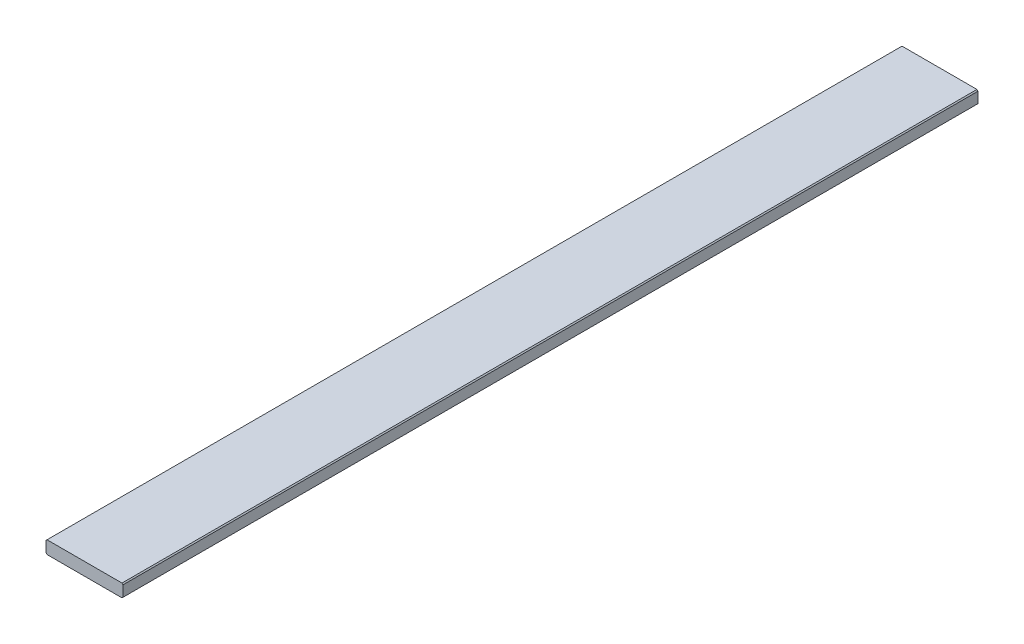
ISO-10303-21;
HEADER;
FILE_DESCRIPTION(('STEP AP214'),'2;1');
FILE_NAME('part.step','',(''),(''),'','','');
FILE_SCHEMA(('AUTOMOTIVE_DESIGN { 1 0 10303 214 1 1 1 1 }'));
ENDSEC;
DATA;
#1=APPLICATION_CONTEXT('core data for automotive mechanical design processes');
#2=APPLICATION_PROTOCOL_DEFINITION('international standard','automotive_design',2000,#1);
#3=PRODUCT_CONTEXT('',#1,'mechanical');
#4=PRODUCT('Part','Part','',(#3));
#5=PRODUCT_RELATED_PRODUCT_CATEGORY('part','',(#4));
#6=PRODUCT_DEFINITION_FORMATION('','',#4);
#7=PRODUCT_DEFINITION_CONTEXT('part definition',#1,'design');
#8=PRODUCT_DEFINITION('design','',#6,#7);
#9=PRODUCT_DEFINITION_SHAPE('','',#8);
#10=(LENGTH_UNIT() NAMED_UNIT(*) SI_UNIT(.MILLI.,.METRE.));
#11=(NAMED_UNIT(*) PLANE_ANGLE_UNIT() SI_UNIT($,.RADIAN.));
#12=(NAMED_UNIT(*) SI_UNIT($,.STERADIAN.) SOLID_ANGLE_UNIT());
#13=UNCERTAINTY_MEASURE_WITH_UNIT(LENGTH_MEASURE(1.E-05),#10,'distance_accuracy_value','');
#14=(GEOMETRIC_REPRESENTATION_CONTEXT(3) GLOBAL_UNCERTAINTY_ASSIGNED_CONTEXT((#13)) GLOBAL_UNIT_ASSIGNED_CONTEXT((#10,
#11,#12)) REPRESENTATION_CONTEXT('',''));
#15=CARTESIAN_POINT('',(0.,0.,0.));
#16=DIRECTION('',(0.,0.,1.));
#17=DIRECTION('',(1.,0.,0.));
#18=AXIS2_PLACEMENT_3D('',#15,#16,#17);
#19=CARTESIAN_POINT('',(-73.,12.5,1665.));
#20=DIRECTION('',(0.,-1.,0.));
#21=DIRECTION('',(0.,0.,-1.));
#22=AXIS2_PLACEMENT_3D('',#19,#20,#21);
#23=PLANE('',#22);
#24=DIRECTION('',(-1.,0.,0.));
#25=VECTOR('',#24,1.);
#26=CARTESIAN_POINT('',(-73.,12.5,0.));
#27=LINE('',#26,#25);
#28=CARTESIAN_POINT('',(73.,12.5,0.));
#29=VERTEX_POINT('',#28);
#30=CARTESIAN_POINT('',(-73.,12.5,0.));
#31=VERTEX_POINT('',#30);
#32=EDGE_CURVE('E130',#29,#31,#27,.T.);
#33=ORIENTED_EDGE('',*,*,#32,.T.);
#34=DIRECTION('',(0.,0.,-1.));
#35=VECTOR('',#34,1.);
#36=CARTESIAN_POINT('',(-73.,12.5,1665.));
#37=LINE('',#36,#35);
#38=CARTESIAN_POINT('',(-73.,12.5,1665.));
#39=VERTEX_POINT('',#38);
#40=EDGE_CURVE('E11',#39,#31,#37,.T.);
#41=ORIENTED_EDGE('',*,*,#40,.F.);
#42=DIRECTION('',(-1.,0.,0.));
#43=VECTOR('',#42,1.);
#44=CARTESIAN_POINT('',(-73.,12.5,1665.));
#45=LINE('',#44,#43);
#46=CARTESIAN_POINT('',(73.,12.5,1665.));
#47=VERTEX_POINT('',#46);
#48=EDGE_CURVE('E144',#47,#39,#45,.T.);
#49=ORIENTED_EDGE('',*,*,#48,.F.);
#50=DIRECTION('',(0.,0.,-1.));
#51=VECTOR('',#50,1.);
#52=CARTESIAN_POINT('',(73.,12.5,1665.));
#53=LINE('',#52,#51);
#54=EDGE_CURVE('E126',#47,#29,#53,.T.);
#55=ORIENTED_EDGE('',*,*,#54,.T.);
#56=EDGE_LOOP('',(#33,#41,#49,#55));
#57=FACE_BOUND('',#56,.T.);
#58=ADVANCED_FACE('F34',(#57),#23,.F.);
#59=CARTESIAN_POINT('',(-75.,10.5,1665.));
#60=DIRECTION('',(0.707106781186547,-0.707106781186548,0.));
#61=DIRECTION('',(0.707106781186548,0.707106781186547,0.));
#62=AXIS2_PLACEMENT_3D('',#59,#60,#61);
#63=PLANE('',#62);
#64=DIRECTION('',(-0.707106781186548,-0.707106781186547,0.));
#65=VECTOR('',#64,1.);
#66=CARTESIAN_POINT('',(-75.,10.5,0.));
#67=LINE('',#66,#65);
#68=CARTESIAN_POINT('',(-75.,10.5,0.));
#69=VERTEX_POINT('',#68);
#70=EDGE_CURVE('E133',#31,#69,#67,.T.);
#71=ORIENTED_EDGE('',*,*,#70,.T.);
#72=DIRECTION('',(0.,0.,-1.));
#73=VECTOR('',#72,1.);
#74=CARTESIAN_POINT('',(-75.,10.5,1665.));
#75=LINE('',#74,#73);
#76=CARTESIAN_POINT('',(-75.,10.5,1665.));
#77=VERTEX_POINT('',#76);
#78=EDGE_CURVE('E42',#77,#69,#75,.T.);
#79=ORIENTED_EDGE('',*,*,#78,.F.);
#80=DIRECTION('',(-0.707106781186548,-0.707106781186547,0.));
#81=VECTOR('',#80,1.);
#82=CARTESIAN_POINT('',(-75.,10.5,1665.));
#83=LINE('',#82,#81);
#84=EDGE_CURVE('E93',#39,#77,#83,.T.);
#85=ORIENTED_EDGE('',*,*,#84,.F.);
#86=ORIENTED_EDGE('',*,*,#40,.T.);
#87=EDGE_LOOP('',(#71,#79,#85,#86));
#88=FACE_BOUND('',#87,.T.);
#89=ADVANCED_FACE('F179',(#88),#63,.F.);
#90=CARTESIAN_POINT('',(-75.,10.5,1665.));
#91=DIRECTION('',(1.,0.,0.));
#92=DIRECTION('',(0.,0.,-1.));
#93=AXIS2_PLACEMENT_3D('',#90,#91,#92);
#94=PLANE('',#93);
#95=DIRECTION('',(0.,-1.,0.));
#96=VECTOR('',#95,1.);
#97=CARTESIAN_POINT('',(-75.,10.5,0.));
#98=LINE('',#97,#96);
#99=CARTESIAN_POINT('',(-75.,-10.5,0.));
#100=VERTEX_POINT('',#99);
#101=EDGE_CURVE('E135',#69,#100,#98,.T.);
#102=ORIENTED_EDGE('',*,*,#101,.T.);
#103=DIRECTION('',(0.,0.,-1.));
#104=VECTOR('',#103,1.);
#105=CARTESIAN_POINT('',(-75.,-10.5,1665.));
#106=LINE('',#105,#104);
#107=CARTESIAN_POINT('',(-75.,-10.5,1665.));
#108=VERTEX_POINT('',#107);
#109=EDGE_CURVE('E151',#108,#100,#106,.T.);
#110=ORIENTED_EDGE('',*,*,#109,.F.);
#111=DIRECTION('',(0.,-1.,0.));
#112=VECTOR('',#111,1.);
#113=CARTESIAN_POINT('',(-75.,10.5,1665.));
#114=LINE('',#113,#112);
#115=EDGE_CURVE('E159',#77,#108,#114,.T.);
#116=ORIENTED_EDGE('',*,*,#115,.F.);
#117=ORIENTED_EDGE('',*,*,#78,.T.);
#118=EDGE_LOOP('',(#102,#110,#116,#117));
#119=FACE_BOUND('',#118,.T.);
#120=ADVANCED_FACE('F157',(#119),#94,.F.);
#121=CARTESIAN_POINT('',(-75.,-10.5,1665.));
#122=DIRECTION('',(0.707106781186547,0.707106781186548,0.));
#123=DIRECTION('',(-0.707106781186548,0.707106781186547,0.));
#124=AXIS2_PLACEMENT_3D('',#121,#122,#123);
#125=PLANE('',#124);
#126=DIRECTION('',(0.707106781186548,-0.707106781186547,0.));
#127=VECTOR('',#126,1.);
#128=CARTESIAN_POINT('',(-75.,-10.5,0.));
#129=LINE('',#128,#127);
#130=CARTESIAN_POINT('',(-73.,-12.5,0.));
#131=VERTEX_POINT('',#130);
#132=EDGE_CURVE('E137',#100,#131,#129,.T.);
#133=ORIENTED_EDGE('',*,*,#132,.T.);
#134=DIRECTION('',(0.,0.,-1.));
#135=VECTOR('',#134,1.);
#136=CARTESIAN_POINT('',(-73.,-12.5,1665.));
#137=LINE('',#136,#135);
#138=CARTESIAN_POINT('',(-73.,-12.5,1665.));
#139=VERTEX_POINT('',#138);
#140=EDGE_CURVE('E148',#139,#131,#137,.T.);
#141=ORIENTED_EDGE('',*,*,#140,.F.);
#142=DIRECTION('',(0.707106781186548,-0.707106781186547,0.));
#143=VECTOR('',#142,1.);
#144=CARTESIAN_POINT('',(-75.,-10.5,1665.));
#145=LINE('',#144,#143);
#146=EDGE_CURVE('E171',#108,#139,#145,.T.);
#147=ORIENTED_EDGE('',*,*,#146,.F.);
#148=ORIENTED_EDGE('',*,*,#109,.T.);
#149=EDGE_LOOP('',(#133,#141,#147,#148));
#150=FACE_BOUND('',#149,.T.);
#151=ADVANCED_FACE('F167',(#150),#125,.F.);
#152=CARTESIAN_POINT('',(-73.,-12.5,1665.));
#153=DIRECTION('',(0.,1.,0.));
#154=DIRECTION('',(0.,0.,1.));
#155=AXIS2_PLACEMENT_3D('',#152,#153,#154);
#156=PLANE('',#155);
#157=DIRECTION('',(1.,0.,0.));
#158=VECTOR('',#157,1.);
#159=CARTESIAN_POINT('',(-73.,-12.5,0.));
#160=LINE('',#159,#158);
#161=CARTESIAN_POINT('',(73.,-12.5,0.));
#162=VERTEX_POINT('',#161);
#163=EDGE_CURVE('E139',#131,#162,#160,.T.);
#164=ORIENTED_EDGE('',*,*,#163,.T.);
#165=DIRECTION('',(0.,0.,-1.));
#166=VECTOR('',#165,1.);
#167=CARTESIAN_POINT('',(73.,-12.5,1665.));
#168=LINE('',#167,#166);
#169=CARTESIAN_POINT('',(73.,-12.5,1665.));
#170=VERTEX_POINT('',#169);
#171=EDGE_CURVE('E121',#170,#162,#168,.T.);
#172=ORIENTED_EDGE('',*,*,#171,.F.);
#173=DIRECTION('',(1.,0.,0.));
#174=VECTOR('',#173,1.);
#175=CARTESIAN_POINT('',(-73.,-12.5,1665.));
#176=LINE('',#175,#174);
#177=EDGE_CURVE('E112',#139,#170,#176,.T.);
#178=ORIENTED_EDGE('',*,*,#177,.F.);
#179=ORIENTED_EDGE('',*,*,#140,.T.);
#180=EDGE_LOOP('',(#164,#172,#178,#179));
#181=FACE_BOUND('',#180,.T.);
#182=ADVANCED_FACE('F170',(#181),#156,.F.);
#183=CARTESIAN_POINT('',(73.,-12.5,1665.));
#184=DIRECTION('',(-0.707106781186547,0.707106781186548,0.));
#185=DIRECTION('',(-0.707106781186548,-0.707106781186547,0.));
#186=AXIS2_PLACEMENT_3D('',#183,#184,#185);
#187=PLANE('',#186);
#188=DIRECTION('',(0.707106781186548,0.707106781186547,0.));
#189=VECTOR('',#188,1.);
#190=CARTESIAN_POINT('',(73.,-12.5,0.));
#191=LINE('',#190,#189);
#192=CARTESIAN_POINT('',(75.,-10.5,0.));
#193=VERTEX_POINT('',#192);
#194=EDGE_CURVE('E120',#162,#193,#191,.T.);
#195=ORIENTED_EDGE('',*,*,#194,.T.);
#196=DIRECTION('',(0.,0.,-1.));
#197=VECTOR('',#196,1.);
#198=CARTESIAN_POINT('',(75.,-10.5,1665.));
#199=LINE('',#198,#197);
#200=CARTESIAN_POINT('',(75.,-10.5,1665.));
#201=VERTEX_POINT('',#200);
#202=EDGE_CURVE('E117',#201,#193,#199,.T.);
#203=ORIENTED_EDGE('',*,*,#202,.F.);
#204=DIRECTION('',(0.707106781186548,0.707106781186547,0.));
#205=VECTOR('',#204,1.);
#206=CARTESIAN_POINT('',(73.,-12.5,1665.));
#207=LINE('',#206,#205);
#208=EDGE_CURVE('E106',#170,#201,#207,.T.);
#209=ORIENTED_EDGE('',*,*,#208,.F.);
#210=ORIENTED_EDGE('',*,*,#171,.T.);
#211=EDGE_LOOP('',(#195,#203,#209,#210));
#212=FACE_BOUND('',#211,.T.);
#213=ADVANCED_FACE('F118',(#212),#187,.F.);
#214=CARTESIAN_POINT('',(75.,10.5,1665.));
#215=DIRECTION('',(-1.,0.,0.));
#216=DIRECTION('',(0.,0.,1.));
#217=AXIS2_PLACEMENT_3D('',#214,#215,#216);
#218=PLANE('',#217);
#219=DIRECTION('',(0.,1.,0.));
#220=VECTOR('',#219,1.);
#221=CARTESIAN_POINT('',(75.,10.5,0.));
#222=LINE('',#221,#220);
#223=CARTESIAN_POINT('',(75.,10.5,0.));
#224=VERTEX_POINT('',#223);
#225=EDGE_CURVE('E79',#193,#224,#222,.T.);
#226=ORIENTED_EDGE('',*,*,#225,.T.);
#227=DIRECTION('',(0.,0.,-1.));
#228=VECTOR('',#227,1.);
#229=CARTESIAN_POINT('',(75.,10.5,1665.));
#230=LINE('',#229,#228);
#231=CARTESIAN_POINT('',(75.,10.5,1665.));
#232=VERTEX_POINT('',#231);
#233=EDGE_CURVE('E122',#232,#224,#230,.T.);
#234=ORIENTED_EDGE('',*,*,#233,.F.);
#235=DIRECTION('',(0.,1.,0.));
#236=VECTOR('',#235,1.);
#237=CARTESIAN_POINT('',(75.,10.5,1665.));
#238=LINE('',#237,#236);
#239=EDGE_CURVE('E110',#201,#232,#238,.T.);
#240=ORIENTED_EDGE('',*,*,#239,.F.);
#241=ORIENTED_EDGE('',*,*,#202,.T.);
#242=EDGE_LOOP('',(#226,#234,#240,#241));
#243=FACE_BOUND('',#242,.T.);
#244=ADVANCED_FACE('F124',(#243),#218,.F.);
#245=CARTESIAN_POINT('',(73.,12.5,1665.));
#246=DIRECTION('',(-0.707106781186547,-0.707106781186548,0.));
#247=DIRECTION('',(0.707106781186548,-0.707106781186547,0.));
#248=AXIS2_PLACEMENT_3D('',#245,#246,#247);
#249=PLANE('',#248);
#250=DIRECTION('',(-0.707106781186548,0.707106781186547,0.));
#251=VECTOR('',#250,1.);
#252=CARTESIAN_POINT('',(73.,12.5,0.));
#253=LINE('',#252,#251);
#254=EDGE_CURVE('E85',#224,#29,#253,.T.);
#255=ORIENTED_EDGE('',*,*,#254,.T.);
#256=ORIENTED_EDGE('',*,*,#54,.F.);
#257=DIRECTION('',(-0.707106781186548,0.707106781186547,0.));
#258=VECTOR('',#257,1.);
#259=CARTESIAN_POINT('',(73.,12.5,1665.));
#260=LINE('',#259,#258);
#261=EDGE_CURVE('E50',#232,#47,#260,.T.);
#262=ORIENTED_EDGE('',*,*,#261,.F.);
#263=ORIENTED_EDGE('',*,*,#233,.T.);
#264=EDGE_LOOP('',(#255,#256,#262,#263));
#265=FACE_BOUND('',#264,.T.);
#266=ADVANCED_FACE('F195',(#265),#249,.F.);
#267=CARTESIAN_POINT('',(0.,0.,1665.));
#268=DIRECTION('',(0.,0.,-1.));
#269=DIRECTION('',(-1.,0.,0.));
#270=AXIS2_PLACEMENT_3D('',#267,#268,#269);
#271=PLANE('',#270);
#272=ORIENTED_EDGE('',*,*,#48,.T.);
#273=ORIENTED_EDGE('',*,*,#84,.T.);
#274=ORIENTED_EDGE('',*,*,#115,.T.);
#275=ORIENTED_EDGE('',*,*,#146,.T.);
#276=ORIENTED_EDGE('',*,*,#177,.T.);
#277=ORIENTED_EDGE('',*,*,#208,.T.);
#278=ORIENTED_EDGE('',*,*,#239,.T.);
#279=ORIENTED_EDGE('',*,*,#261,.T.);
#280=EDGE_LOOP('',(#272,#273,#274,#275,#276,#277,#278,#279));
#281=FACE_BOUND('',#280,.T.);
#282=ADVANCED_FACE('F108',(#281),#271,.F.);
#283=CARTESIAN_POINT('',(0.,0.,0.));
#284=DIRECTION('',(0.,0.,-1.));
#285=DIRECTION('',(-1.,0.,0.));
#286=AXIS2_PLACEMENT_3D('',#283,#284,#285);
#287=PLANE('',#286);
#288=ORIENTED_EDGE('',*,*,#32,.F.);
#289=ORIENTED_EDGE('',*,*,#254,.F.);
#290=ORIENTED_EDGE('',*,*,#225,.F.);
#291=ORIENTED_EDGE('',*,*,#194,.F.);
#292=ORIENTED_EDGE('',*,*,#163,.F.);
#293=ORIENTED_EDGE('',*,*,#132,.F.);
#294=ORIENTED_EDGE('',*,*,#101,.F.);
#295=ORIENTED_EDGE('',*,*,#70,.F.);
#296=EDGE_LOOP('',(#288,#289,#290,#291,#292,#293,#294,#295));
#297=FACE_BOUND('',#296,.T.);
#298=ADVANCED_FACE('F163',(#297),#287,.T.);
#299=CLOSED_SHELL('',(#58,#89,#120,#151,#182,#213,#244,#266,#282,#298));
#300=MANIFOLD_SOLID_BREP('B2',#299);
#301=ADVANCED_BREP_SHAPE_REPRESENTATION('',(#18,#300),#14);
#302=SHAPE_DEFINITION_REPRESENTATION(#9,#301);
ENDSEC;
END-ISO-10303-21;
